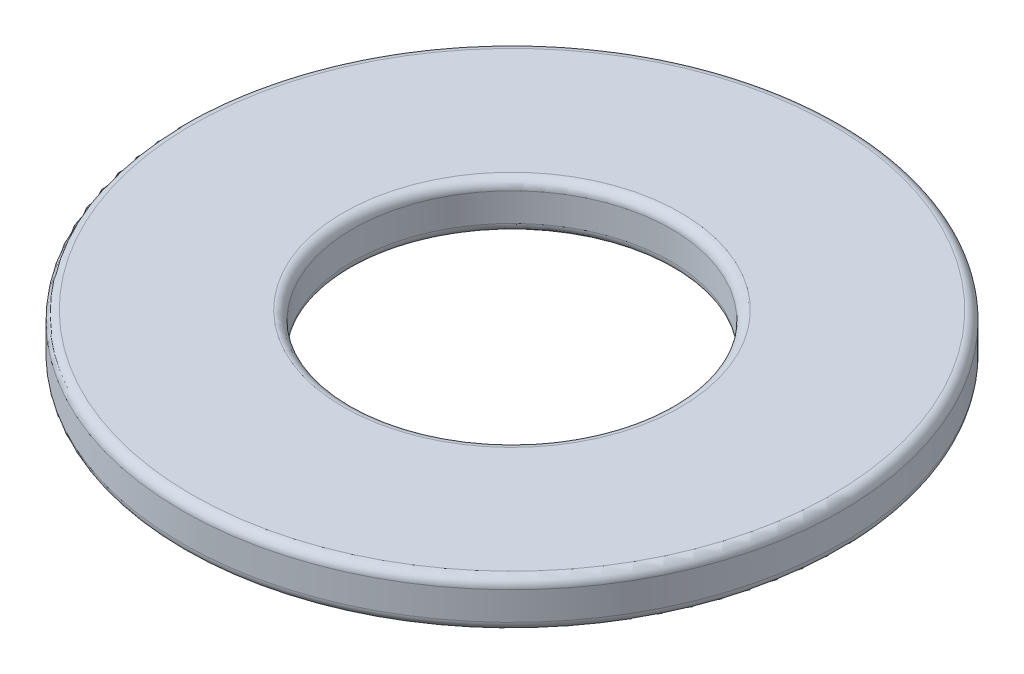
ISO-10303-21;
HEADER;
FILE_DESCRIPTION(('STEP AP214'),'2;1');
FILE_NAME('part.step','',(''),(''),'','','');
FILE_SCHEMA(('AUTOMOTIVE_DESIGN { 1 0 10303 214 1 1 1 1 }'));
ENDSEC;
DATA;
#1=APPLICATION_CONTEXT('core data for automotive mechanical design processes');
#2=APPLICATION_PROTOCOL_DEFINITION('international standard','automotive_design',2000,#1);
#3=PRODUCT_CONTEXT('',#1,'mechanical');
#4=PRODUCT('Part','Part','',(#3));
#5=PRODUCT_RELATED_PRODUCT_CATEGORY('part','',(#4));
#6=PRODUCT_DEFINITION_FORMATION('','',#4);
#7=PRODUCT_DEFINITION_CONTEXT('part definition',#1,'design');
#8=PRODUCT_DEFINITION('design','',#6,#7);
#9=PRODUCT_DEFINITION_SHAPE('','',#8);
#10=(LENGTH_UNIT() NAMED_UNIT(*) SI_UNIT(.MILLI.,.METRE.));
#11=(NAMED_UNIT(*) PLANE_ANGLE_UNIT() SI_UNIT($,.RADIAN.));
#12=(NAMED_UNIT(*) SI_UNIT($,.STERADIAN.) SOLID_ANGLE_UNIT());
#13=UNCERTAINTY_MEASURE_WITH_UNIT(LENGTH_MEASURE(1.E-05),#10,'distance_accuracy_value','');
#14=(GEOMETRIC_REPRESENTATION_CONTEXT(3) GLOBAL_UNCERTAINTY_ASSIGNED_CONTEXT((#13)) GLOBAL_UNIT_ASSIGNED_CONTEXT((#10,
#11,#12)) REPRESENTATION_CONTEXT('',''));
#15=CARTESIAN_POINT('',(0.,0.,0.));
#16=DIRECTION('',(0.,0.,1.));
#17=DIRECTION('',(1.,0.,0.));
#18=AXIS2_PLACEMENT_3D('',#15,#16,#17);
#19=CARTESIAN_POINT('',(0.,0.5,0.));
#20=DIRECTION('',(0.,1.,0.));
#21=DIRECTION('',(0.,0.,1.));
#22=AXIS2_PLACEMENT_3D('',#19,#20,#21);
#23=PLANE('',#22);
#24=CARTESIAN_POINT('',(0.,0.5,0.));
#25=DIRECTION('',(0.,1.,0.));
#26=DIRECTION('',(0.,0.,1.));
#27=AXIS2_PLACEMENT_3D('',#24,#25,#26);
#28=CIRCLE('',#27,1.79);
#29=CARTESIAN_POINT('',(0.,0.5,1.79));
#30=VERTEX_POINT('',#29);
#31=EDGE_CURVE('E10',#30,#30,#28,.F.);
#32=ORIENTED_EDGE('',*,*,#31,.T.);
#33=EDGE_LOOP('',(#32));
#34=FACE_BOUND('',#33,.T.);
#35=CARTESIAN_POINT('',(0.,0.5,0.));
#36=DIRECTION('',(0.,1.,0.));
#37=DIRECTION('',(0.,0.,1.));
#38=AXIS2_PLACEMENT_3D('',#35,#36,#37);
#39=CIRCLE('',#38,3.4);
#40=CARTESIAN_POINT('',(0.,0.5,3.4));
#41=VERTEX_POINT('',#40);
#42=EDGE_CURVE('E45',#41,#41,#39,.T.);
#43=ORIENTED_EDGE('',*,*,#42,.T.);
#44=EDGE_LOOP('',(#43));
#45=FACE_BOUND('',#44,.T.);
#46=ADVANCED_FACE('F37',(#34,#45),#23,.T.);
#47=CARTESIAN_POINT('',(0.,0.,0.));
#48=DIRECTION('',(0.,1.,0.));
#49=DIRECTION('',(0.,0.,1.));
#50=AXIS2_PLACEMENT_3D('',#47,#48,#49);
#51=PLANE('',#50);
#52=CARTESIAN_POINT('',(0.,0.,0.));
#53=DIRECTION('',(0.,1.,0.));
#54=DIRECTION('',(0.,0.,1.));
#55=AXIS2_PLACEMENT_3D('',#52,#53,#54);
#56=CIRCLE('',#55,1.79);
#57=CARTESIAN_POINT('',(0.,0.,1.79));
#58=VERTEX_POINT('',#57);
#59=EDGE_CURVE('E69',#58,#58,#56,.T.);
#60=ORIENTED_EDGE('',*,*,#59,.T.);
#61=EDGE_LOOP('',(#60));
#62=FACE_BOUND('',#61,.T.);
#63=CARTESIAN_POINT('',(0.,0.,0.));
#64=DIRECTION('',(0.,1.,0.));
#65=DIRECTION('',(0.,0.,1.));
#66=AXIS2_PLACEMENT_3D('',#63,#64,#65);
#67=CIRCLE('',#66,3.4);
#68=CARTESIAN_POINT('',(0.,0.,3.4));
#69=VERTEX_POINT('',#68);
#70=EDGE_CURVE('E73',#69,#69,#67,.F.);
#71=ORIENTED_EDGE('',*,*,#70,.T.);
#72=EDGE_LOOP('',(#71));
#73=FACE_BOUND('',#72,.T.);
#74=ADVANCED_FACE('F78',(#62,#73),#51,.F.);
#75=CARTESIAN_POINT('',(0.,0.5,0.));
#76=DIRECTION('',(0.,-1.,0.));
#77=DIRECTION('',(0.,0.,-1.));
#78=AXIS2_PLACEMENT_3D('',#75,#76,#77);
#79=CYLINDRICAL_SURFACE('',#78,3.5);
#80=CARTESIAN_POINT('',(0.,0.1,0.));
#81=DIRECTION('',(0.,1.,0.));
#82=DIRECTION('',(0.,0.,1.));
#83=AXIS2_PLACEMENT_3D('',#80,#81,#82);
#84=CIRCLE('',#83,3.5);
#85=CARTESIAN_POINT('',(0.,0.1,3.5));
#86=VERTEX_POINT('',#85);
#87=EDGE_CURVE('E50',#86,#86,#84,.T.);
#88=ORIENTED_EDGE('',*,*,#87,.T.);
#89=EDGE_LOOP('',(#88));
#90=FACE_BOUND('',#89,.T.);
#91=CARTESIAN_POINT('',(0.,0.4,0.));
#92=DIRECTION('',(0.,1.,0.));
#93=DIRECTION('',(0.,0.,1.));
#94=AXIS2_PLACEMENT_3D('',#91,#92,#93);
#95=CIRCLE('',#94,3.5);
#96=CARTESIAN_POINT('',(0.,0.4,3.5));
#97=VERTEX_POINT('',#96);
#98=EDGE_CURVE('E55',#97,#97,#95,.F.);
#99=ORIENTED_EDGE('',*,*,#98,.T.);
#100=EDGE_LOOP('',(#99));
#101=FACE_BOUND('',#100,.T.);
#102=ADVANCED_FACE('F88',(#90,#101),#79,.T.);
#103=CARTESIAN_POINT('',(0.,0.5,0.));
#104=DIRECTION('',(0.,-1.,0.));
#105=DIRECTION('',(0.,0.,-1.));
#106=AXIS2_PLACEMENT_3D('',#103,#104,#105);
#107=CYLINDRICAL_SURFACE('',#106,1.69);
#108=CARTESIAN_POINT('',(0.,0.1,0.));
#109=DIRECTION('',(0.,1.,0.));
#110=DIRECTION('',(0.,0.,1.));
#111=AXIS2_PLACEMENT_3D('',#108,#109,#110);
#112=CIRCLE('',#111,1.69);
#113=CARTESIAN_POINT('',(0.,0.1,1.69));
#114=VERTEX_POINT('',#113);
#115=EDGE_CURVE('E61',#114,#114,#112,.F.);
#116=ORIENTED_EDGE('',*,*,#115,.T.);
#117=EDGE_LOOP('',(#116));
#118=FACE_BOUND('',#117,.T.);
#119=CARTESIAN_POINT('',(0.,0.4,0.));
#120=DIRECTION('',(0.,1.,0.));
#121=DIRECTION('',(0.,0.,1.));
#122=AXIS2_PLACEMENT_3D('',#119,#120,#121);
#123=CIRCLE('',#122,1.69);
#124=CARTESIAN_POINT('',(0.,0.4,1.69));
#125=VERTEX_POINT('',#124);
#126=EDGE_CURVE('E65',#125,#125,#123,.T.);
#127=ORIENTED_EDGE('',*,*,#126,.T.);
#128=EDGE_LOOP('',(#127));
#129=FACE_BOUND('',#128,.T.);
#130=ADVANCED_FACE('F91',(#118,#129),#107,.F.);
#131=CARTESIAN_POINT('',(0.,0.1,0.));
#132=DIRECTION('',(0.,1.,0.));
#133=DIRECTION('',(0.,0.,1.));
#134=AXIS2_PLACEMENT_3D('',#131,#132,#133);
#135=TOROIDAL_SURFACE('',#134,1.79,0.1);
#136=ORIENTED_EDGE('',*,*,#115,.F.);
#137=EDGE_LOOP('',(#136));
#138=FACE_BOUND('',#137,.T.);
#139=ORIENTED_EDGE('',*,*,#59,.F.);
#140=EDGE_LOOP('',(#139));
#141=FACE_BOUND('',#140,.T.);
#142=ADVANCED_FACE('F84',(#138,#141),#135,.T.);
#143=CARTESIAN_POINT('',(0.,0.1,0.));
#144=DIRECTION('',(0.,1.,0.));
#145=DIRECTION('',(0.,0.,1.));
#146=AXIS2_PLACEMENT_3D('',#143,#144,#145);
#147=TOROIDAL_SURFACE('',#146,3.4,0.1);
#148=ORIENTED_EDGE('',*,*,#70,.F.);
#149=EDGE_LOOP('',(#148));
#150=FACE_BOUND('',#149,.T.);
#151=ORIENTED_EDGE('',*,*,#87,.F.);
#152=EDGE_LOOP('',(#151));
#153=FACE_BOUND('',#152,.T.);
#154=ADVANCED_FACE('F80',(#150,#153),#147,.T.);
#155=CARTESIAN_POINT('',(0.,0.4,0.));
#156=DIRECTION('',(0.,1.,0.));
#157=DIRECTION('',(0.,0.,1.));
#158=AXIS2_PLACEMENT_3D('',#155,#156,#157);
#159=TOROIDAL_SURFACE('',#158,1.79,0.1);
#160=ORIENTED_EDGE('',*,*,#31,.F.);
#161=EDGE_LOOP('',(#160));
#162=FACE_BOUND('',#161,.T.);
#163=ORIENTED_EDGE('',*,*,#126,.F.);
#164=EDGE_LOOP('',(#163));
#165=FACE_BOUND('',#164,.T.);
#166=ADVANCED_FACE('F83',(#162,#165),#159,.T.);
#167=CARTESIAN_POINT('',(0.,0.4,0.));
#168=DIRECTION('',(0.,1.,0.));
#169=DIRECTION('',(0.,0.,1.));
#170=AXIS2_PLACEMENT_3D('',#167,#168,#169);
#171=TOROIDAL_SURFACE('',#170,3.4,0.1);
#172=ORIENTED_EDGE('',*,*,#98,.F.);
#173=EDGE_LOOP('',(#172));
#174=FACE_BOUND('',#173,.T.);
#175=ORIENTED_EDGE('',*,*,#42,.F.);
#176=EDGE_LOOP('',(#175));
#177=FACE_BOUND('',#176,.T.);
#178=ADVANCED_FACE('F39',(#174,#177),#171,.T.);
#179=CLOSED_SHELL('',(#46,#74,#102,#130,#142,#154,#166,#178));
#180=MANIFOLD_SOLID_BREP('B2',#179);
#181=ADVANCED_BREP_SHAPE_REPRESENTATION('',(#18,#180),#14);
#182=SHAPE_DEFINITION_REPRESENTATION(#9,#181);
ENDSEC;
END-ISO-10303-21;
